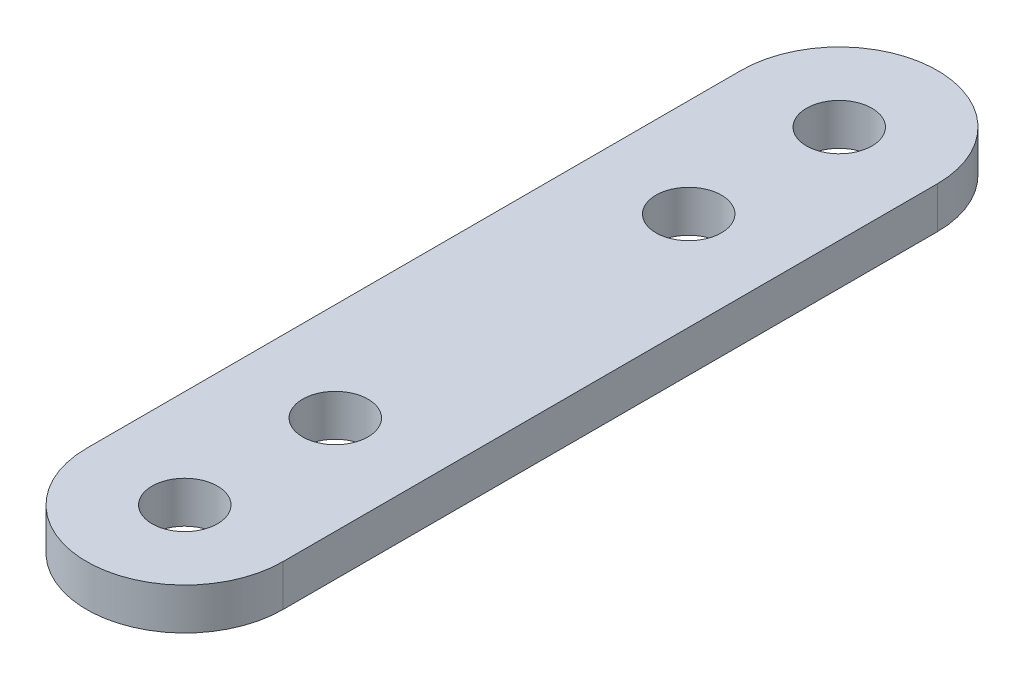
ISO-10303-21;
HEADER;
FILE_DESCRIPTION(('STEP AP214'),'2;1');
FILE_NAME('part.step','',(''),(''),'','','');
FILE_SCHEMA(('AUTOMOTIVE_DESIGN { 1 0 10303 214 1 1 1 1 }'));
ENDSEC;
DATA;
#1=APPLICATION_CONTEXT('core data for automotive mechanical design processes');
#2=APPLICATION_PROTOCOL_DEFINITION('international standard','automotive_design',2000,#1);
#3=PRODUCT_CONTEXT('',#1,'mechanical');
#4=PRODUCT('Part','Part','',(#3));
#5=PRODUCT_RELATED_PRODUCT_CATEGORY('part','',(#4));
#6=PRODUCT_DEFINITION_FORMATION('','',#4);
#7=PRODUCT_DEFINITION_CONTEXT('part definition',#1,'design');
#8=PRODUCT_DEFINITION('design','',#6,#7);
#9=PRODUCT_DEFINITION_SHAPE('','',#8);
#10=(LENGTH_UNIT() NAMED_UNIT(*) SI_UNIT(.MILLI.,.METRE.));
#11=(NAMED_UNIT(*) PLANE_ANGLE_UNIT() SI_UNIT($,.RADIAN.));
#12=(NAMED_UNIT(*) SI_UNIT($,.STERADIAN.) SOLID_ANGLE_UNIT());
#13=UNCERTAINTY_MEASURE_WITH_UNIT(LENGTH_MEASURE(1.E-05),#10,'distance_accuracy_value','');
#14=(GEOMETRIC_REPRESENTATION_CONTEXT(3) GLOBAL_UNCERTAINTY_ASSIGNED_CONTEXT((#13)) GLOBAL_UNIT_ASSIGNED_CONTEXT((#10,
#11,#12)) REPRESENTATION_CONTEXT('',''));
#15=CARTESIAN_POINT('',(0.,0.,0.));
#16=DIRECTION('',(0.,0.,1.));
#17=DIRECTION('',(1.,0.,0.));
#18=AXIS2_PLACEMENT_3D('',#15,#16,#17);
#19=CARTESIAN_POINT('',(0.,3.175,-25.));
#20=DIRECTION('',(0.,-1.,0.));
#21=DIRECTION('',(0.,0.,-1.));
#22=AXIS2_PLACEMENT_3D('',#19,#20,#21);
#23=PLANE('',#22);
#24=CARTESIAN_POINT('',(0.,3.175,-25.));
#25=DIRECTION('',(0.,1.,0.));
#26=DIRECTION('',(0.,0.,-1.));
#27=AXIS2_PLACEMENT_3D('',#24,#25,#26);
#28=CIRCLE('',#27,7.49999999999999);
#29=CARTESIAN_POINT('',(7.49999999999998,3.175,-25.));
#30=VERTEX_POINT('',#29);
#31=CARTESIAN_POINT('',(-7.5,3.175,-25.));
#32=VERTEX_POINT('',#31);
#33=EDGE_CURVE('E92',#30,#32,#28,.T.);
#34=ORIENTED_EDGE('',*,*,#33,.T.);
#35=DIRECTION('',(0.,0.,1.));
#36=VECTOR('',#35,1.);
#37=CARTESIAN_POINT('',(-7.5,3.175,-25.));
#38=LINE('',#37,#36);
#39=CARTESIAN_POINT('',(-7.49999999999999,3.175,25.));
#40=VERTEX_POINT('',#39);
#41=EDGE_CURVE('E87',#32,#40,#38,.T.);
#42=ORIENTED_EDGE('',*,*,#41,.T.);
#43=CARTESIAN_POINT('',(0.,3.175,25.));
#44=DIRECTION('',(0.,1.,0.));
#45=DIRECTION('',(0.,0.,1.));
#46=AXIS2_PLACEMENT_3D('',#43,#44,#45);
#47=CIRCLE('',#46,7.49999999999999);
#48=CARTESIAN_POINT('',(7.49999999999999,3.175,25.));
#49=VERTEX_POINT('',#48);
#50=EDGE_CURVE('E90',#40,#49,#47,.T.);
#51=ORIENTED_EDGE('',*,*,#50,.T.);
#52=DIRECTION('',(0.,0.,-1.));
#53=VECTOR('',#52,1.);
#54=CARTESIAN_POINT('',(7.49999999999998,3.175,-25.));
#55=LINE('',#54,#53);
#56=EDGE_CURVE('E57',#49,#30,#55,.T.);
#57=ORIENTED_EDGE('',*,*,#56,.T.);
#58=EDGE_LOOP('',(#34,#42,#51,#57));
#59=FACE_BOUND('',#58,.T.);
#60=CARTESIAN_POINT('',(0.,3.175,-25.));
#61=DIRECTION('',(0.,1.,0.));
#62=DIRECTION('',(0.,0.,1.));
#63=AXIS2_PLACEMENT_3D('',#60,#61,#62);
#64=CIRCLE('',#63,2.5);
#65=CARTESIAN_POINT('',(0.,3.175,-22.5));
#66=VERTEX_POINT('',#65);
#67=EDGE_CURVE('E112',#66,#66,#64,.T.);
#68=ORIENTED_EDGE('',*,*,#67,.F.);
#69=EDGE_LOOP('',(#68));
#70=FACE_BOUND('',#69,.T.);
#71=CARTESIAN_POINT('',(0.,3.175,25.));
#72=DIRECTION('',(0.,1.,0.));
#73=DIRECTION('',(0.,0.,1.));
#74=AXIS2_PLACEMENT_3D('',#71,#72,#73);
#75=CIRCLE('',#74,2.5);
#76=CARTESIAN_POINT('',(0.,3.175,27.5));
#77=VERTEX_POINT('',#76);
#78=EDGE_CURVE('E134',#77,#77,#75,.T.);
#79=ORIENTED_EDGE('',*,*,#78,.F.);
#80=EDGE_LOOP('',(#79));
#81=FACE_BOUND('',#80,.T.);
#82=CARTESIAN_POINT('',(0.,3.175,-13.5));
#83=DIRECTION('',(0.,1.,0.));
#84=DIRECTION('',(0.,0.,1.));
#85=AXIS2_PLACEMENT_3D('',#82,#83,#84);
#86=CIRCLE('',#85,2.5);
#87=CARTESIAN_POINT('',(0.,3.175,-11.));
#88=VERTEX_POINT('',#87);
#89=EDGE_CURVE('E142',#88,#88,#86,.T.);
#90=ORIENTED_EDGE('',*,*,#89,.F.);
#91=EDGE_LOOP('',(#90));
#92=FACE_BOUND('',#91,.T.);
#93=CARTESIAN_POINT('',(0.,3.175,13.5));
#94=DIRECTION('',(0.,1.,0.));
#95=DIRECTION('',(0.,0.,1.));
#96=AXIS2_PLACEMENT_3D('',#93,#94,#95);
#97=CIRCLE('',#96,2.5);
#98=CARTESIAN_POINT('',(0.,3.175,16.));
#99=VERTEX_POINT('',#98);
#100=EDGE_CURVE('E150',#99,#99,#97,.T.);
#101=ORIENTED_EDGE('',*,*,#100,.F.);
#102=EDGE_LOOP('',(#101));
#103=FACE_BOUND('',#102,.T.);
#104=ADVANCED_FACE('F39',(#59,#70,#81,#92,#103),#23,.F.);
#105=CARTESIAN_POINT('',(0.,0.,-25.));
#106=DIRECTION('',(0.,-1.,0.));
#107=DIRECTION('',(0.,0.,-1.));
#108=AXIS2_PLACEMENT_3D('',#105,#106,#107);
#109=PLANE('',#108);
#110=CARTESIAN_POINT('',(0.,0.,-13.5));
#111=DIRECTION('',(0.,1.,0.));
#112=DIRECTION('',(0.,0.,1.));
#113=AXIS2_PLACEMENT_3D('',#110,#111,#112);
#114=CIRCLE('',#113,2.5);
#115=CARTESIAN_POINT('',(0.,0.,-11.));
#116=VERTEX_POINT('',#115);
#117=EDGE_CURVE('E146',#116,#116,#114,.T.);
#118=ORIENTED_EDGE('',*,*,#117,.T.);
#119=EDGE_LOOP('',(#118));
#120=FACE_BOUND('',#119,.T.);
#121=CARTESIAN_POINT('',(0.,0.,-25.));
#122=DIRECTION('',(0.,1.,0.));
#123=DIRECTION('',(0.,0.,1.));
#124=AXIS2_PLACEMENT_3D('',#121,#122,#123);
#125=CIRCLE('',#124,2.5);
#126=CARTESIAN_POINT('',(0.,0.,-22.5));
#127=VERTEX_POINT('',#126);
#128=EDGE_CURVE('E130',#127,#127,#125,.T.);
#129=ORIENTED_EDGE('',*,*,#128,.T.);
#130=EDGE_LOOP('',(#129));
#131=FACE_BOUND('',#130,.T.);
#132=CARTESIAN_POINT('',(0.,0.,-25.));
#133=DIRECTION('',(0.,1.,0.));
#134=DIRECTION('',(0.,0.,-1.));
#135=AXIS2_PLACEMENT_3D('',#132,#133,#134);
#136=CIRCLE('',#135,7.49999999999999);
#137=CARTESIAN_POINT('',(7.49999999999998,0.,-25.));
#138=VERTEX_POINT('',#137);
#139=CARTESIAN_POINT('',(-7.5,0.,-25.));
#140=VERTEX_POINT('',#139);
#141=EDGE_CURVE('E108',#138,#140,#136,.T.);
#142=ORIENTED_EDGE('',*,*,#141,.F.);
#143=DIRECTION('',(0.,0.,-1.));
#144=VECTOR('',#143,1.);
#145=CARTESIAN_POINT('',(7.49999999999998,0.,-25.));
#146=LINE('',#145,#144);
#147=CARTESIAN_POINT('',(7.49999999999999,0.,25.));
#148=VERTEX_POINT('',#147);
#149=EDGE_CURVE('E80',#148,#138,#146,.T.);
#150=ORIENTED_EDGE('',*,*,#149,.F.);
#151=CARTESIAN_POINT('',(0.,0.,25.));
#152=DIRECTION('',(0.,1.,0.));
#153=DIRECTION('',(0.,0.,1.));
#154=AXIS2_PLACEMENT_3D('',#151,#152,#153);
#155=CIRCLE('',#154,7.49999999999999);
#156=CARTESIAN_POINT('',(-7.49999999999999,0.,25.));
#157=VERTEX_POINT('',#156);
#158=EDGE_CURVE('E74',#157,#148,#155,.T.);
#159=ORIENTED_EDGE('',*,*,#158,.F.);
#160=DIRECTION('',(0.,0.,1.));
#161=VECTOR('',#160,1.);
#162=CARTESIAN_POINT('',(-7.5,0.,-25.));
#163=LINE('',#162,#161);
#164=EDGE_CURVE('E97',#140,#157,#163,.T.);
#165=ORIENTED_EDGE('',*,*,#164,.F.);
#166=EDGE_LOOP('',(#142,#150,#159,#165));
#167=FACE_BOUND('',#166,.T.);
#168=CARTESIAN_POINT('',(0.,0.,25.));
#169=DIRECTION('',(0.,1.,0.));
#170=DIRECTION('',(0.,0.,1.));
#171=AXIS2_PLACEMENT_3D('',#168,#169,#170);
#172=CIRCLE('',#171,2.5);
#173=CARTESIAN_POINT('',(0.,0.,27.5));
#174=VERTEX_POINT('',#173);
#175=EDGE_CURVE('E138',#174,#174,#172,.T.);
#176=ORIENTED_EDGE('',*,*,#175,.T.);
#177=EDGE_LOOP('',(#176));
#178=FACE_BOUND('',#177,.T.);
#179=CARTESIAN_POINT('',(0.,0.,13.5));
#180=DIRECTION('',(0.,1.,0.));
#181=DIRECTION('',(0.,0.,1.));
#182=AXIS2_PLACEMENT_3D('',#179,#180,#181);
#183=CIRCLE('',#182,2.5);
#184=CARTESIAN_POINT('',(0.,0.,16.));
#185=VERTEX_POINT('',#184);
#186=EDGE_CURVE('E154',#185,#185,#183,.T.);
#187=ORIENTED_EDGE('',*,*,#186,.T.);
#188=EDGE_LOOP('',(#187));
#189=FACE_BOUND('',#188,.T.);
#190=ADVANCED_FACE('F125',(#120,#131,#167,#178,#189),#109,.T.);
#191=CARTESIAN_POINT('',(0.,3.175,-25.));
#192=DIRECTION('',(0.,-1.,0.));
#193=DIRECTION('',(0.,0.,-1.));
#194=AXIS2_PLACEMENT_3D('',#191,#192,#193);
#195=CYLINDRICAL_SURFACE('',#194,7.49999999999999);
#196=ORIENTED_EDGE('',*,*,#141,.T.);
#197=DIRECTION('',(0.,-1.,0.));
#198=VECTOR('',#197,1.);
#199=CARTESIAN_POINT('',(-7.5,3.175,-25.));
#200=LINE('',#199,#198);
#201=EDGE_CURVE('E11',#32,#140,#200,.T.);
#202=ORIENTED_EDGE('',*,*,#201,.F.);
#203=ORIENTED_EDGE('',*,*,#33,.F.);
#204=DIRECTION('',(0.,-1.,0.));
#205=VECTOR('',#204,1.);
#206=CARTESIAN_POINT('',(7.49999999999998,3.175,-25.));
#207=LINE('',#206,#205);
#208=EDGE_CURVE('E104',#30,#138,#207,.T.);
#209=ORIENTED_EDGE('',*,*,#208,.T.);
#210=EDGE_LOOP('',(#196,#202,#203,#209));
#211=FACE_BOUND('',#210,.T.);
#212=ADVANCED_FACE('F41',(#211),#195,.T.);
#213=CARTESIAN_POINT('',(-7.5,3.175,-25.));
#214=DIRECTION('',(1.,0.,0.));
#215=DIRECTION('',(0.,0.,-1.));
#216=AXIS2_PLACEMENT_3D('',#213,#214,#215);
#217=PLANE('',#216);
#218=ORIENTED_EDGE('',*,*,#164,.T.);
#219=DIRECTION('',(0.,-1.,0.));
#220=VECTOR('',#219,1.);
#221=CARTESIAN_POINT('',(-7.49999999999999,3.175,25.));
#222=LINE('',#221,#220);
#223=EDGE_CURVE('E49',#40,#157,#222,.T.);
#224=ORIENTED_EDGE('',*,*,#223,.F.);
#225=ORIENTED_EDGE('',*,*,#41,.F.);
#226=ORIENTED_EDGE('',*,*,#201,.T.);
#227=EDGE_LOOP('',(#218,#224,#225,#226));
#228=FACE_BOUND('',#227,.T.);
#229=ADVANCED_FACE('F96',(#228),#217,.F.);
#230=CARTESIAN_POINT('',(0.,3.175,25.));
#231=DIRECTION('',(0.,-1.,0.));
#232=DIRECTION('',(0.,0.,-1.));
#233=AXIS2_PLACEMENT_3D('',#230,#231,#232);
#234=CYLINDRICAL_SURFACE('',#233,7.49999999999999);
#235=ORIENTED_EDGE('',*,*,#158,.T.);
#236=DIRECTION('',(0.,-1.,0.));
#237=VECTOR('',#236,1.);
#238=CARTESIAN_POINT('',(7.49999999999999,3.175,25.));
#239=LINE('',#238,#237);
#240=EDGE_CURVE('E99',#49,#148,#239,.T.);
#241=ORIENTED_EDGE('',*,*,#240,.F.);
#242=ORIENTED_EDGE('',*,*,#50,.F.);
#243=ORIENTED_EDGE('',*,*,#223,.T.);
#244=EDGE_LOOP('',(#235,#241,#242,#243));
#245=FACE_BOUND('',#244,.T.);
#246=ADVANCED_FACE('F100',(#245),#234,.T.);
#247=CARTESIAN_POINT('',(7.49999999999998,3.175,-25.));
#248=DIRECTION('',(-1.,0.,0.));
#249=DIRECTION('',(0.,0.,1.));
#250=AXIS2_PLACEMENT_3D('',#247,#248,#249);
#251=PLANE('',#250);
#252=ORIENTED_EDGE('',*,*,#149,.T.);
#253=ORIENTED_EDGE('',*,*,#208,.F.);
#254=ORIENTED_EDGE('',*,*,#56,.F.);
#255=ORIENTED_EDGE('',*,*,#240,.T.);
#256=EDGE_LOOP('',(#252,#253,#254,#255));
#257=FACE_BOUND('',#256,.T.);
#258=ADVANCED_FACE('F122',(#257),#251,.F.);
#259=CARTESIAN_POINT('',(0.,3.175,-25.));
#260=DIRECTION('',(0.,-1.,0.));
#261=DIRECTION('',(0.,0.,-1.));
#262=AXIS2_PLACEMENT_3D('',#259,#260,#261);
#263=CYLINDRICAL_SURFACE('',#262,2.5);
#264=ORIENTED_EDGE('',*,*,#67,.T.);
#265=EDGE_LOOP('',(#264));
#266=FACE_BOUND('',#265,.T.);
#267=ORIENTED_EDGE('',*,*,#128,.F.);
#268=EDGE_LOOP('',(#267));
#269=FACE_BOUND('',#268,.T.);
#270=ADVANCED_FACE('F173',(#266,#269),#263,.F.);
#271=CARTESIAN_POINT('',(0.,3.175,25.));
#272=DIRECTION('',(0.,-1.,0.));
#273=DIRECTION('',(0.,0.,-1.));
#274=AXIS2_PLACEMENT_3D('',#271,#272,#273);
#275=CYLINDRICAL_SURFACE('',#274,2.5);
#276=ORIENTED_EDGE('',*,*,#78,.T.);
#277=EDGE_LOOP('',(#276));
#278=FACE_BOUND('',#277,.T.);
#279=ORIENTED_EDGE('',*,*,#175,.F.);
#280=EDGE_LOOP('',(#279));
#281=FACE_BOUND('',#280,.T.);
#282=ADVANCED_FACE('F219',(#278,#281),#275,.F.);
#283=CARTESIAN_POINT('',(0.,3.175,-13.5));
#284=DIRECTION('',(0.,-1.,0.));
#285=DIRECTION('',(0.,0.,-1.));
#286=AXIS2_PLACEMENT_3D('',#283,#284,#285);
#287=CYLINDRICAL_SURFACE('',#286,2.5);
#288=ORIENTED_EDGE('',*,*,#89,.T.);
#289=EDGE_LOOP('',(#288));
#290=FACE_BOUND('',#289,.T.);
#291=ORIENTED_EDGE('',*,*,#117,.F.);
#292=EDGE_LOOP('',(#291));
#293=FACE_BOUND('',#292,.T.);
#294=ADVANCED_FACE('F227',(#290,#293),#287,.F.);
#295=CARTESIAN_POINT('',(0.,3.175,13.5));
#296=DIRECTION('',(0.,-1.,0.));
#297=DIRECTION('',(0.,0.,-1.));
#298=AXIS2_PLACEMENT_3D('',#295,#296,#297);
#299=CYLINDRICAL_SURFACE('',#298,2.5);
#300=ORIENTED_EDGE('',*,*,#100,.T.);
#301=EDGE_LOOP('',(#300));
#302=FACE_BOUND('',#301,.T.);
#303=ORIENTED_EDGE('',*,*,#186,.F.);
#304=EDGE_LOOP('',(#303));
#305=FACE_BOUND('',#304,.T.);
#306=ADVANCED_FACE('F162',(#302,#305),#299,.F.);
#307=CLOSED_SHELL('',(#104,#190,#212,#229,#246,#258,#270,#282,#294,#306));
#308=MANIFOLD_SOLID_BREP('B2',#307);
#309=ADVANCED_BREP_SHAPE_REPRESENTATION('',(#18,#308),#14);
#310=SHAPE_DEFINITION_REPRESENTATION(#9,#309);
ENDSEC;
END-ISO-10303-21;
